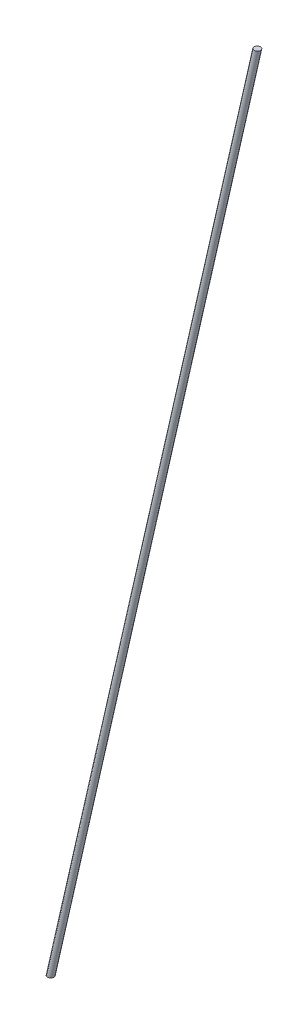
ISO-10303-21;
HEADER;
FILE_DESCRIPTION(('STEP AP214'),'2;1');
FILE_NAME('part.step','',(''),(''),'','','');
FILE_SCHEMA(('AUTOMOTIVE_DESIGN { 1 0 10303 214 1 1 1 1 }'));
ENDSEC;
DATA;
#1=APPLICATION_CONTEXT('core data for automotive mechanical design processes');
#2=APPLICATION_PROTOCOL_DEFINITION('international standard','automotive_design',2000,#1);
#3=PRODUCT_CONTEXT('',#1,'mechanical');
#4=PRODUCT('Part','Part','',(#3));
#5=PRODUCT_RELATED_PRODUCT_CATEGORY('part','',(#4));
#6=PRODUCT_DEFINITION_FORMATION('','',#4);
#7=PRODUCT_DEFINITION_CONTEXT('part definition',#1,'design');
#8=PRODUCT_DEFINITION('design','',#6,#7);
#9=PRODUCT_DEFINITION_SHAPE('','',#8);
#10=(LENGTH_UNIT() NAMED_UNIT(*) SI_UNIT(.MILLI.,.METRE.));
#11=(NAMED_UNIT(*) PLANE_ANGLE_UNIT() SI_UNIT($,.RADIAN.));
#12=(NAMED_UNIT(*) SI_UNIT($,.STERADIAN.) SOLID_ANGLE_UNIT());
#13=UNCERTAINTY_MEASURE_WITH_UNIT(LENGTH_MEASURE(1.E-05),#10,'distance_accuracy_value','');
#14=(GEOMETRIC_REPRESENTATION_CONTEXT(3) GLOBAL_UNCERTAINTY_ASSIGNED_CONTEXT((#13)) GLOBAL_UNIT_ASSIGNED_CONTEXT((#10,
#11,#12)) REPRESENTATION_CONTEXT('',''));
#15=CARTESIAN_POINT('',(0.,0.,0.));
#16=DIRECTION('',(0.,0.,1.));
#17=DIRECTION('',(1.,0.,0.));
#18=AXIS2_PLACEMENT_3D('',#15,#16,#17);
#19=CARTESIAN_POINT('',(-130.,-570.,0.));
#20=DIRECTION('',(0.,1.,0.));
#21=DIRECTION('',(0.,0.,1.));
#22=AXIS2_PLACEMENT_3D('',#19,#20,#21);
#23=PLANE('',#22);
#24=CARTESIAN_POINT('',(-130.,-570.,0.));
#25=DIRECTION('',(0.,1.,0.));
#26=DIRECTION('',(0.,0.,1.));
#27=AXIS2_PLACEMENT_3D('',#24,#25,#26);
#28=CIRCLE('',#27,2.);
#29=CARTESIAN_POINT('',(-130.,-570.,2.));
#30=VERTEX_POINT('',#29);
#31=EDGE_CURVE('E44',#30,#30,#28,.T.);
#32=ORIENTED_EDGE('',*,*,#31,.F.);
#33=EDGE_LOOP('',(#32));
#34=FACE_BOUND('',#33,.T.);
#35=ADVANCED_FACE('F37',(#34),#23,.F.);
#36=CARTESIAN_POINT('',(0.,0.,0.));
#37=DIRECTION('',(0.,1.,0.));
#38=DIRECTION('',(0.,0.,1.));
#39=AXIS2_PLACEMENT_3D('',#36,#37,#38);
#40=PLANE('',#39);
#41=CARTESIAN_POINT('',(0.,0.,0.));
#42=DIRECTION('',(0.,1.,0.));
#43=DIRECTION('',(0.,0.,1.));
#44=AXIS2_PLACEMENT_3D('',#41,#42,#43);
#45=CIRCLE('',#44,2.);
#46=CARTESIAN_POINT('',(0.,0.,2.));
#47=VERTEX_POINT('',#46);
#48=EDGE_CURVE('E10',#47,#47,#45,.T.);
#49=ORIENTED_EDGE('',*,*,#48,.T.);
#50=EDGE_LOOP('',(#49));
#51=FACE_BOUND('',#50,.T.);
#52=ADVANCED_FACE('F54',(#51),#40,.T.);
#53=CARTESIAN_POINT('',(-130.,-570.,2.));
#54=CARTESIAN_POINT('',(0.,0.,2.));
#55=CARTESIAN_POINT('',(-126.,-570.,2.));
#56=CARTESIAN_POINT('',(4.,0.,2.));
#57=CARTESIAN_POINT('',(-126.,-570.,-2.));
#58=CARTESIAN_POINT('',(4.,0.,-2.));
#59=CARTESIAN_POINT('',(-130.,-570.,-2.));
#60=CARTESIAN_POINT('',(0.,0.,-2.));
#61=CARTESIAN_POINT('',(-134.,-570.,-2.));
#62=CARTESIAN_POINT('',(-4.,0.,-2.));
#63=CARTESIAN_POINT('',(-134.,-570.,2.));
#64=CARTESIAN_POINT('',(-4.,0.,2.));
#65=CARTESIAN_POINT('',(-130.,-570.,2.));
#66=CARTESIAN_POINT('',(0.,0.,2.));
#67=(BOUNDED_SURFACE() B_SPLINE_SURFACE(3,1,((#53,#54),(#55,#56),(#57,#58),(#59,#60),(#61,#62),
(#63,#64),(#65,#66)),.UNSPECIFIED.,.T.,.F.,.F.) B_SPLINE_SURFACE_WITH_KNOTS((4,3,4),(2,2),(0.,
0.5,1.),(0.,1.),.UNSPECIFIED.) GEOMETRIC_REPRESENTATION_ITEM() RATIONAL_B_SPLINE_SURFACE(((1.,
1.),(0.333333333333333,0.333333333333333),(0.333333333333333,0.333333333333333),(1.,1.),
(0.333333333333333,0.333333333333333),(0.333333333333333,0.333333333333333),(1.,1.))) REPRESENTATION_ITEM('') SURFACE());
#68=CARTESIAN_POINT('',(0.,0.,2.));
#69=CARTESIAN_POINT('',(-1.35416666666667,-5.9375,2.));
#70=CARTESIAN_POINT('',(-2.70833333333333,-11.875,2.));
#71=CARTESIAN_POINT('',(-5.41666666666666,-23.75,2.));
#72=CARTESIAN_POINT('',(-6.77083333333333,-29.6875,2.));
#73=CARTESIAN_POINT('',(-9.47916666666666,-41.5625,2.));
#74=CARTESIAN_POINT('',(-10.8333333333333,-47.5,2.));
#75=CARTESIAN_POINT('',(-13.5416666666667,-59.375,2.));
#76=CARTESIAN_POINT('',(-14.8958333333333,-65.3125,2.));
#77=CARTESIAN_POINT('',(-17.6041666666667,-77.1875,2.));
#78=CARTESIAN_POINT('',(-18.9583333333333,-83.125,2.));
#79=CARTESIAN_POINT('',(-21.6666666666667,-95.,2.));
#80=CARTESIAN_POINT('',(-23.0208333333333,-100.9375,2.));
#81=CARTESIAN_POINT('',(-25.7291666666667,-112.8125,2.));
#82=CARTESIAN_POINT('',(-27.0833333333333,-118.75,2.));
#83=CARTESIAN_POINT('',(-29.7916666666667,-130.625,2.));
#84=CARTESIAN_POINT('',(-31.1458333333333,-136.5625,2.));
#85=CARTESIAN_POINT('',(-33.8541666666667,-148.4375,2.));
#86=CARTESIAN_POINT('',(-35.2083333333333,-154.375,2.));
#87=CARTESIAN_POINT('',(-37.9166666666667,-166.25,2.));
#88=CARTESIAN_POINT('',(-39.2708333333333,-172.1875,2.));
#89=CARTESIAN_POINT('',(-41.9791666666667,-184.0625,2.));
#90=CARTESIAN_POINT('',(-43.3333333333333,-190.,2.));
#91=CARTESIAN_POINT('',(-46.0416666666667,-201.875,2.));
#92=CARTESIAN_POINT('',(-47.3958333333333,-207.8125,2.));
#93=CARTESIAN_POINT('',(-50.1041666666666,-219.6875,2.));
#94=CARTESIAN_POINT('',(-51.4583333333333,-225.625,2.));
#95=CARTESIAN_POINT('',(-54.1666666666667,-237.5,2.));
#96=CARTESIAN_POINT('',(-55.5208333333333,-243.4375,2.));
#97=CARTESIAN_POINT('',(-58.2291666666666,-255.3125,2.));
#98=CARTESIAN_POINT('',(-59.5833333333333,-261.25,2.));
#99=CARTESIAN_POINT('',(-62.2916666666666,-273.125,2.));
#100=CARTESIAN_POINT('',(-63.6458333333333,-279.0625,2.));
#101=CARTESIAN_POINT('',(-66.3541666666666,-290.9375,2.));
#102=CARTESIAN_POINT('',(-67.7083333333333,-296.875,2.));
#103=CARTESIAN_POINT('',(-70.4166666666666,-308.75,2.));
#104=CARTESIAN_POINT('',(-71.7708333333333,-314.6875,2.));
#105=CARTESIAN_POINT('',(-74.4791666666666,-326.5625,2.));
#106=CARTESIAN_POINT('',(-75.8333333333333,-332.5,2.));
#107=CARTESIAN_POINT('',(-78.5416666666666,-344.375,2.));
#108=CARTESIAN_POINT('',(-79.8958333333333,-350.3125,2.));
#109=CARTESIAN_POINT('',(-82.6041666666666,-362.1875,2.));
#110=CARTESIAN_POINT('',(-83.9583333333333,-368.125,2.));
#111=CARTESIAN_POINT('',(-86.6666666666666,-380.,2.));
#112=CARTESIAN_POINT('',(-88.0208333333333,-385.9375,2.));
#113=CARTESIAN_POINT('',(-90.7291666666666,-397.8125,2.));
#114=CARTESIAN_POINT('',(-92.0833333333333,-403.75,2.));
#115=CARTESIAN_POINT('',(-94.7916666666666,-415.625,2.));
#116=CARTESIAN_POINT('',(-96.1458333333333,-421.5625,2.));
#117=CARTESIAN_POINT('',(-98.8541666666666,-433.4375,2.));
#118=CARTESIAN_POINT('',(-100.208333333333,-439.375,2.));
#119=CARTESIAN_POINT('',(-102.916666666667,-451.25,2.));
#120=CARTESIAN_POINT('',(-104.270833333333,-457.1875,2.));
#121=CARTESIAN_POINT('',(-106.979166666667,-469.0625,2.));
#122=CARTESIAN_POINT('',(-108.333333333333,-475.,2.));
#123=CARTESIAN_POINT('',(-111.041666666667,-486.875,2.));
#124=CARTESIAN_POINT('',(-112.395833333333,-492.8125,2.));
#125=CARTESIAN_POINT('',(-115.104166666667,-504.6875,2.));
#126=CARTESIAN_POINT('',(-116.458333333333,-510.625,2.));
#127=CARTESIAN_POINT('',(-119.166666666667,-522.5,2.));
#128=CARTESIAN_POINT('',(-120.520833333333,-528.4375,2.));
#129=CARTESIAN_POINT('',(-123.229166666667,-540.3125,2.));
#130=CARTESIAN_POINT('',(-124.583333333333,-546.25,2.));
#131=CARTESIAN_POINT('',(-127.291666666667,-558.125,2.));
#132=CARTESIAN_POINT('',(-128.645833333333,-564.0625,2.));
#133=CARTESIAN_POINT('',(-130.,-570.,2.));
#134=B_SPLINE_CURVE_WITH_KNOTS('',3,(#68,#69,#70,#71,#72,#73,#74,#75,#76,#77,#78,#79,#80,#81,
#82,#83,#84,#85,#86,#87,#88,#89,#90,#91,#92,#93,#94,#95,#96,#97,#98,#99,#100,#101,#102,#103,
#104,#105,#106,#107,#108,#109,#110,#111,#112,#113,#114,#115,#116,#117,#118,#119,#120,#121,#122,
#123,#124,#125,#126,#127,#128,#129,#130,#131,#132,#133),.UNSPECIFIED.,.F.,.F.,(4,2,2,2,2,2,2,2,
2,2,2,2,2,2,2,2,2,2,2,2,2,2,2,2,2,2,2,2,2,2,2,2,4),(0.,18.2698949778043,36.5397899556087,
54.809684933413,73.0795799112173,91.3494748890217,109.619369866826,127.88926484463,
146.159159822435,164.429054800239,182.698949778043,200.968844755848,219.238739733652,
237.508634711456,255.778529689261,274.048424667065,292.318319644869,310.588214622674,
328.858109600478,347.128004578282,365.397899556087,383.667794533891,401.937689511695,
420.2075844895,438.477479467304,456.747374445108,475.017269422913,493.287164400717,
511.557059378521,529.826954356326,548.09684933413,566.366744311934,584.636639289738),.UNSPECIFIED.);
#135=EDGE_CURVE('BSEAM51',#47,#30,#134,.T.);
#136=ORIENTED_EDGE('',*,*,#48,.F.);
#137=ORIENTED_EDGE('',*,*,#31,.T.);
#138=ORIENTED_EDGE('',*,*,#135,.T.);
#139=ORIENTED_EDGE('',*,*,#135,.F.);
#140=EDGE_LOOP('',(#136,#138,#137,#139));
#141=FACE_BOUND('',#140,.T.);
#142=ADVANCED_FACE('F51',(#141),#67,.T.);
#143=CLOSED_SHELL('',(#35,#52,#142));
#144=MANIFOLD_SOLID_BREP('B2',#143);
#145=ADVANCED_BREP_SHAPE_REPRESENTATION('',(#18,#144),#14);
#146=SHAPE_DEFINITION_REPRESENTATION(#9,#145);
ENDSEC;
END-ISO-10303-21;
